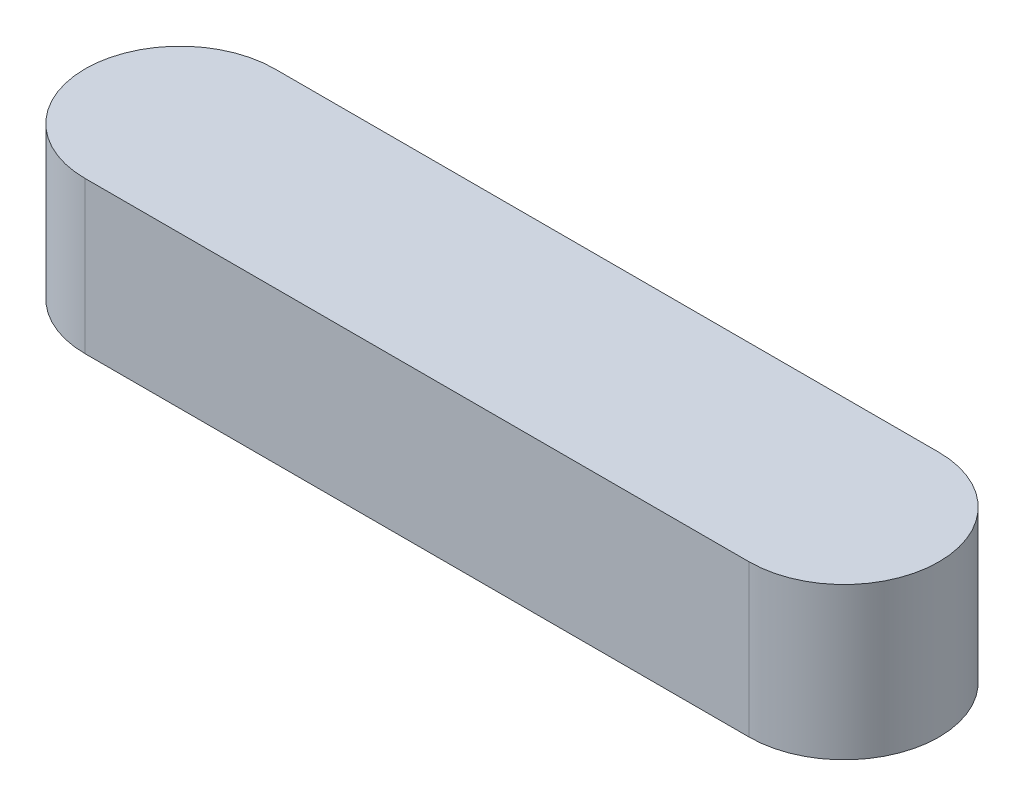
ISO-10303-21;
HEADER;
FILE_DESCRIPTION(('STEP AP214'),'2;1');
FILE_NAME('part.step','',(''),(''),'','','');
FILE_SCHEMA(('AUTOMOTIVE_DESIGN { 1 0 10303 214 1 1 1 1 }'));
ENDSEC;
DATA;
#1=APPLICATION_CONTEXT('core data for automotive mechanical design processes');
#2=APPLICATION_PROTOCOL_DEFINITION('international standard','automotive_design',2000,#1);
#3=PRODUCT_CONTEXT('',#1,'mechanical');
#4=PRODUCT('Part','Part','',(#3));
#5=PRODUCT_RELATED_PRODUCT_CATEGORY('part','',(#4));
#6=PRODUCT_DEFINITION_FORMATION('','',#4);
#7=PRODUCT_DEFINITION_CONTEXT('part definition',#1,'design');
#8=PRODUCT_DEFINITION('design','',#6,#7);
#9=PRODUCT_DEFINITION_SHAPE('','',#8);
#10=(LENGTH_UNIT() NAMED_UNIT(*) SI_UNIT(.MILLI.,.METRE.));
#11=(NAMED_UNIT(*) PLANE_ANGLE_UNIT() SI_UNIT($,.RADIAN.));
#12=(NAMED_UNIT(*) SI_UNIT($,.STERADIAN.) SOLID_ANGLE_UNIT());
#13=UNCERTAINTY_MEASURE_WITH_UNIT(LENGTH_MEASURE(1.E-05),#10,'distance_accuracy_value','');
#14=(GEOMETRIC_REPRESENTATION_CONTEXT(3) GLOBAL_UNCERTAINTY_ASSIGNED_CONTEXT((#13)) GLOBAL_UNIT_ASSIGNED_CONTEXT((#10,
#11,#12)) REPRESENTATION_CONTEXT('',''));
#15=CARTESIAN_POINT('',(0.,0.,0.));
#16=DIRECTION('',(0.,0.,1.));
#17=DIRECTION('',(1.,0.,0.));
#18=AXIS2_PLACEMENT_3D('',#15,#16,#17);
#19=CARTESIAN_POINT('',(0.,-2.,2.5));
#20=DIRECTION('',(0.,0.,1.));
#21=DIRECTION('',(1.,0.,0.));
#22=AXIS2_PLACEMENT_3D('',#19,#20,#21);
#23=PLANE('',#22);
#24=DIRECTION('',(0.,1.,0.));
#25=VECTOR('',#24,1.);
#26=CARTESIAN_POINT('',(8.75,-2.,2.5));
#27=LINE('',#26,#25);
#28=CARTESIAN_POINT('',(8.75,-2.,2.5));
#29=VERTEX_POINT('',#28);
#30=CARTESIAN_POINT('',(8.75,2.,2.5));
#31=VERTEX_POINT('',#30);
#32=EDGE_CURVE('E38',#29,#31,#27,.T.);
#33=ORIENTED_EDGE('',*,*,#32,.T.);
#34=DIRECTION('',(1.,0.,0.));
#35=VECTOR('',#34,1.);
#36=CARTESIAN_POINT('',(0.,2.,2.5));
#37=LINE('',#36,#35);
#38=CARTESIAN_POINT('',(-8.75,2.,2.5));
#39=VERTEX_POINT('',#38);
#40=EDGE_CURVE('E75',#39,#31,#37,.T.);
#41=ORIENTED_EDGE('',*,*,#40,.F.);
#42=DIRECTION('',(0.,1.,0.));
#43=VECTOR('',#42,1.);
#44=CARTESIAN_POINT('',(-8.75,-2.,2.5));
#45=LINE('',#44,#43);
#46=CARTESIAN_POINT('',(-8.75,-2.,2.5));
#47=VERTEX_POINT('',#46);
#48=EDGE_CURVE('E11',#47,#39,#45,.T.);
#49=ORIENTED_EDGE('',*,*,#48,.F.);
#50=DIRECTION('',(1.,0.,0.));
#51=VECTOR('',#50,1.);
#52=CARTESIAN_POINT('',(0.,-2.,2.5));
#53=LINE('',#52,#51);
#54=EDGE_CURVE('E76',#47,#29,#53,.T.);
#55=ORIENTED_EDGE('',*,*,#54,.T.);
#56=EDGE_LOOP('',(#33,#41,#49,#55));
#57=FACE_BOUND('',#56,.T.);
#58=ADVANCED_FACE('F35',(#57),#23,.T.);
#59=CARTESIAN_POINT('',(-8.75,-2.,0.));
#60=DIRECTION('',(0.,1.,0.));
#61=DIRECTION('',(0.,0.,1.));
#62=AXIS2_PLACEMENT_3D('',#59,#60,#61);
#63=CYLINDRICAL_SURFACE('',#62,2.5);
#64=ORIENTED_EDGE('',*,*,#48,.T.);
#65=CARTESIAN_POINT('',(-8.75,2.,0.));
#66=DIRECTION('',(0.,1.,0.));
#67=DIRECTION('',(0.,0.,1.));
#68=AXIS2_PLACEMENT_3D('',#65,#66,#67);
#69=CIRCLE('',#68,2.5);
#70=CARTESIAN_POINT('',(-8.75,2.,-2.5));
#71=VERTEX_POINT('',#70);
#72=EDGE_CURVE('E93',#71,#39,#69,.T.);
#73=ORIENTED_EDGE('',*,*,#72,.F.);
#74=DIRECTION('',(0.,1.,0.));
#75=VECTOR('',#74,1.);
#76=CARTESIAN_POINT('',(-8.75,-2.,-2.5));
#77=LINE('',#76,#75);
#78=CARTESIAN_POINT('',(-8.75,-2.,-2.5));
#79=VERTEX_POINT('',#78);
#80=EDGE_CURVE('E43',#79,#71,#77,.T.);
#81=ORIENTED_EDGE('',*,*,#80,.F.);
#82=CARTESIAN_POINT('',(-8.75,-2.,0.));
#83=DIRECTION('',(0.,1.,0.));
#84=DIRECTION('',(0.,0.,1.));
#85=AXIS2_PLACEMENT_3D('',#82,#83,#84);
#86=CIRCLE('',#85,2.5);
#87=EDGE_CURVE('E81',#79,#47,#86,.T.);
#88=ORIENTED_EDGE('',*,*,#87,.T.);
#89=EDGE_LOOP('',(#64,#73,#81,#88));
#90=FACE_BOUND('',#89,.T.);
#91=ADVANCED_FACE('F107',(#90),#63,.T.);
#92=CARTESIAN_POINT('',(0.,-2.,-2.5));
#93=DIRECTION('',(0.,0.,1.));
#94=DIRECTION('',(1.,0.,0.));
#95=AXIS2_PLACEMENT_3D('',#92,#93,#94);
#96=PLANE('',#95);
#97=ORIENTED_EDGE('',*,*,#80,.T.);
#98=DIRECTION('',(1.,0.,0.));
#99=VECTOR('',#98,1.);
#100=CARTESIAN_POINT('',(0.,2.,-2.5));
#101=LINE('',#100,#99);
#102=CARTESIAN_POINT('',(8.75,2.,-2.5));
#103=VERTEX_POINT('',#102);
#104=EDGE_CURVE('E89',#71,#103,#101,.T.);
#105=ORIENTED_EDGE('',*,*,#104,.T.);
#106=DIRECTION('',(0.,1.,0.));
#107=VECTOR('',#106,1.);
#108=CARTESIAN_POINT('',(8.75,-2.,-2.5));
#109=LINE('',#108,#107);
#110=CARTESIAN_POINT('',(8.75,-2.,-2.5));
#111=VERTEX_POINT('',#110);
#112=EDGE_CURVE('E80',#111,#103,#109,.T.);
#113=ORIENTED_EDGE('',*,*,#112,.F.);
#114=DIRECTION('',(1.,0.,0.));
#115=VECTOR('',#114,1.);
#116=CARTESIAN_POINT('',(0.,-2.,-2.5));
#117=LINE('',#116,#115);
#118=EDGE_CURVE('E101',#79,#111,#117,.T.);
#119=ORIENTED_EDGE('',*,*,#118,.F.);
#120=EDGE_LOOP('',(#97,#105,#113,#119));
#121=FACE_BOUND('',#120,.T.);
#122=ADVANCED_FACE('F105',(#121),#96,.F.);
#123=CARTESIAN_POINT('',(8.75,-2.,0.));
#124=DIRECTION('',(0.,1.,0.));
#125=DIRECTION('',(0.,0.,1.));
#126=AXIS2_PLACEMENT_3D('',#123,#124,#125);
#127=CYLINDRICAL_SURFACE('',#126,2.5);
#128=ORIENTED_EDGE('',*,*,#112,.T.);
#129=CARTESIAN_POINT('',(8.75,2.,0.));
#130=DIRECTION('',(0.,1.,0.));
#131=DIRECTION('',(0.,0.,1.));
#132=AXIS2_PLACEMENT_3D('',#129,#130,#131);
#133=CIRCLE('',#132,2.5);
#134=EDGE_CURVE('E83',#31,#103,#133,.T.);
#135=ORIENTED_EDGE('',*,*,#134,.F.);
#136=ORIENTED_EDGE('',*,*,#32,.F.);
#137=CARTESIAN_POINT('',(8.75,-2.,0.));
#138=DIRECTION('',(0.,1.,0.));
#139=DIRECTION('',(0.,0.,1.));
#140=AXIS2_PLACEMENT_3D('',#137,#138,#139);
#141=CIRCLE('',#140,2.5);
#142=EDGE_CURVE('E99',#29,#111,#141,.T.);
#143=ORIENTED_EDGE('',*,*,#142,.T.);
#144=EDGE_LOOP('',(#128,#135,#136,#143));
#145=FACE_BOUND('',#144,.T.);
#146=ADVANCED_FACE('F84',(#145),#127,.T.);
#147=CARTESIAN_POINT('',(0.,-2.,0.));
#148=DIRECTION('',(0.,1.,0.));
#149=DIRECTION('',(0.,0.,1.));
#150=AXIS2_PLACEMENT_3D('',#147,#148,#149);
#151=PLANE('',#150);
#152=ORIENTED_EDGE('',*,*,#54,.F.);
#153=ORIENTED_EDGE('',*,*,#87,.F.);
#154=ORIENTED_EDGE('',*,*,#118,.T.);
#155=ORIENTED_EDGE('',*,*,#142,.F.);
#156=EDGE_LOOP('',(#152,#153,#154,#155));
#157=FACE_BOUND('',#156,.T.);
#158=ADVANCED_FACE('F109',(#157),#151,.F.);
#159=CARTESIAN_POINT('',(0.,2.,0.));
#160=DIRECTION('',(0.,1.,0.));
#161=DIRECTION('',(0.,0.,1.));
#162=AXIS2_PLACEMENT_3D('',#159,#160,#161);
#163=PLANE('',#162);
#164=ORIENTED_EDGE('',*,*,#40,.T.);
#165=ORIENTED_EDGE('',*,*,#134,.T.);
#166=ORIENTED_EDGE('',*,*,#104,.F.);
#167=ORIENTED_EDGE('',*,*,#72,.T.);
#168=EDGE_LOOP('',(#164,#165,#166,#167));
#169=FACE_BOUND('',#168,.T.);
#170=ADVANCED_FACE('F92',(#169),#163,.T.);
#171=CLOSED_SHELL('',(#58,#91,#122,#146,#158,#170));
#172=MANIFOLD_SOLID_BREP('B2',#171);
#173=ADVANCED_BREP_SHAPE_REPRESENTATION('',(#18,#172),#14);
#174=SHAPE_DEFINITION_REPRESENTATION(#9,#173);
ENDSEC;
END-ISO-10303-21;
